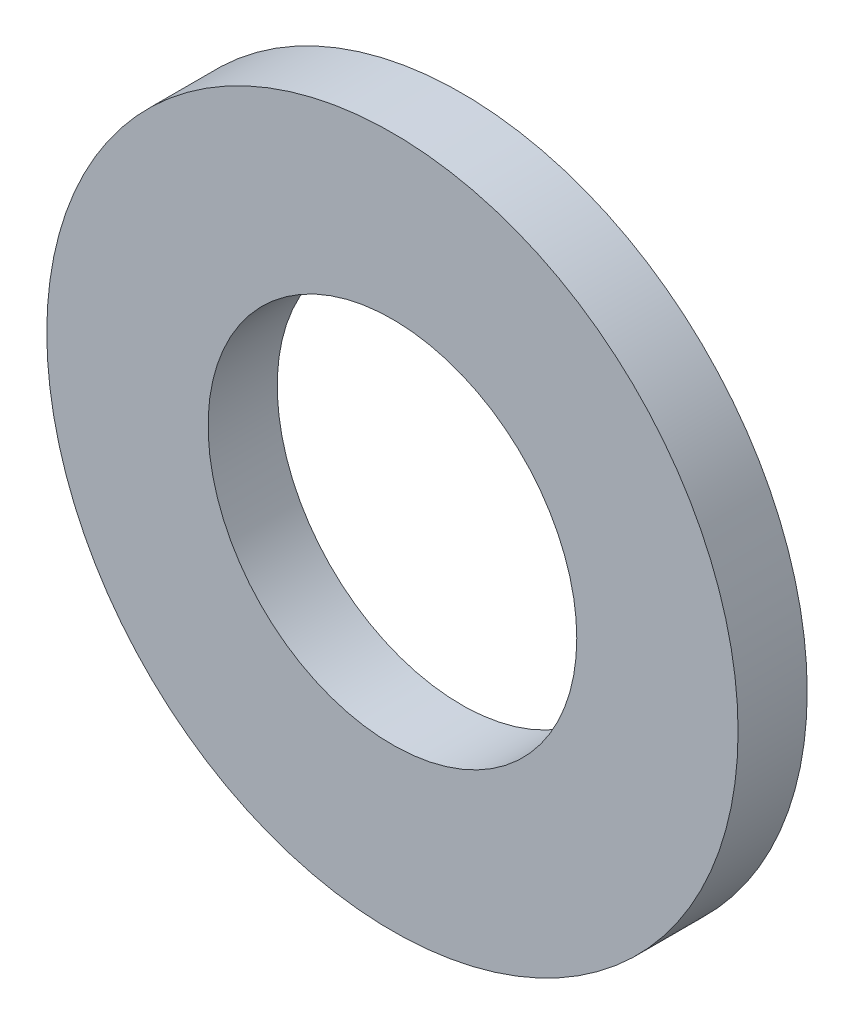
ISO-10303-21;
HEADER;
FILE_DESCRIPTION(('STEP AP214'),'2;1');
FILE_NAME('part.step','',(''),(''),'','','');
FILE_SCHEMA(('AUTOMOTIVE_DESIGN { 1 0 10303 214 1 1 1 1 }'));
ENDSEC;
DATA;
#1=APPLICATION_CONTEXT('core data for automotive mechanical design processes');
#2=APPLICATION_PROTOCOL_DEFINITION('international standard','automotive_design',2000,#1);
#3=PRODUCT_CONTEXT('',#1,'mechanical');
#4=PRODUCT('Part','Part','',(#3));
#5=PRODUCT_RELATED_PRODUCT_CATEGORY('part','',(#4));
#6=PRODUCT_DEFINITION_FORMATION('','',#4);
#7=PRODUCT_DEFINITION_CONTEXT('part definition',#1,'design');
#8=PRODUCT_DEFINITION('design','',#6,#7);
#9=PRODUCT_DEFINITION_SHAPE('','',#8);
#10=(LENGTH_UNIT() NAMED_UNIT(*) SI_UNIT(.MILLI.,.METRE.));
#11=(NAMED_UNIT(*) PLANE_ANGLE_UNIT() SI_UNIT($,.RADIAN.));
#12=(NAMED_UNIT(*) SI_UNIT($,.STERADIAN.) SOLID_ANGLE_UNIT());
#13=UNCERTAINTY_MEASURE_WITH_UNIT(LENGTH_MEASURE(1.E-05),#10,'distance_accuracy_value','');
#14=(GEOMETRIC_REPRESENTATION_CONTEXT(3) GLOBAL_UNCERTAINTY_ASSIGNED_CONTEXT((#13)) GLOBAL_UNIT_ASSIGNED_CONTEXT((#10,
#11,#12)) REPRESENTATION_CONTEXT('',''));
#15=CARTESIAN_POINT('',(0.,0.,0.));
#16=DIRECTION('',(0.,0.,1.));
#17=DIRECTION('',(1.,0.,0.));
#18=AXIS2_PLACEMENT_3D('',#15,#16,#17);
#19=CARTESIAN_POINT('',(0.,0.,0.6));
#20=DIRECTION('',(0.,0.,1.));
#21=DIRECTION('',(1.,0.,0.));
#22=AXIS2_PLACEMENT_3D('',#19,#20,#21);
#23=PLANE('',#22);
#24=CARTESIAN_POINT('',(0.,0.,0.6));
#25=DIRECTION('',(0.,0.,1.));
#26=DIRECTION('',(1.,0.,0.));
#27=AXIS2_PLACEMENT_3D('',#24,#25,#26);
#28=CIRCLE('',#27,3.);
#29=CARTESIAN_POINT('',(3.,0.,0.6));
#30=VERTEX_POINT('',#29);
#31=EDGE_CURVE('E10',#30,#30,#28,.T.);
#32=ORIENTED_EDGE('',*,*,#31,.T.);
#33=EDGE_LOOP('',(#32));
#34=FACE_BOUND('',#33,.T.);
#35=CARTESIAN_POINT('',(0.,0.,0.6));
#36=DIRECTION('',(0.,0.,1.));
#37=DIRECTION('',(1.,0.,0.));
#38=AXIS2_PLACEMENT_3D('',#35,#36,#37);
#39=CIRCLE('',#38,1.6);
#40=CARTESIAN_POINT('',(1.6,0.,0.6));
#41=VERTEX_POINT('',#40);
#42=EDGE_CURVE('E42',#41,#41,#39,.T.);
#43=ORIENTED_EDGE('',*,*,#42,.F.);
#44=EDGE_LOOP('',(#43));
#45=FACE_BOUND('',#44,.T.);
#46=ADVANCED_FACE('F31',(#34,#45),#23,.T.);
#47=CARTESIAN_POINT('',(0.,0.,0.));
#48=DIRECTION('',(0.,0.,1.));
#49=DIRECTION('',(1.,0.,0.));
#50=AXIS2_PLACEMENT_3D('',#47,#48,#49);
#51=PLANE('',#50);
#52=CARTESIAN_POINT('',(0.,0.,0.));
#53=DIRECTION('',(0.,0.,1.));
#54=DIRECTION('',(1.,0.,0.));
#55=AXIS2_PLACEMENT_3D('',#52,#53,#54);
#56=CIRCLE('',#55,3.);
#57=CARTESIAN_POINT('',(3.,0.,0.));
#58=VERTEX_POINT('',#57);
#59=EDGE_CURVE('E35',#58,#58,#56,.T.);
#60=ORIENTED_EDGE('',*,*,#59,.F.);
#61=EDGE_LOOP('',(#60));
#62=FACE_BOUND('',#61,.T.);
#63=CARTESIAN_POINT('',(0.,0.,0.));
#64=DIRECTION('',(0.,0.,1.));
#65=DIRECTION('',(1.,0.,0.));
#66=AXIS2_PLACEMENT_3D('',#63,#64,#65);
#67=CIRCLE('',#66,1.6);
#68=CARTESIAN_POINT('',(1.6,0.,0.));
#69=VERTEX_POINT('',#68);
#70=EDGE_CURVE('E44',#69,#69,#67,.T.);
#71=ORIENTED_EDGE('',*,*,#70,.T.);
#72=EDGE_LOOP('',(#71));
#73=FACE_BOUND('',#72,.T.);
#74=ADVANCED_FACE('F54',(#62,#73),#51,.F.);
#75=CARTESIAN_POINT('',(0.,0.,0.6));
#76=DIRECTION('',(0.,0.,-1.));
#77=DIRECTION('',(-1.,0.,0.));
#78=AXIS2_PLACEMENT_3D('',#75,#76,#77);
#79=CYLINDRICAL_SURFACE('',#78,3.);
#80=ORIENTED_EDGE('',*,*,#31,.F.);
#81=EDGE_LOOP('',(#80));
#82=FACE_BOUND('',#81,.T.);
#83=ORIENTED_EDGE('',*,*,#59,.T.);
#84=EDGE_LOOP('',(#83));
#85=FACE_BOUND('',#84,.T.);
#86=ADVANCED_FACE('F33',(#82,#85),#79,.T.);
#87=CARTESIAN_POINT('',(0.,0.,0.6));
#88=DIRECTION('',(0.,0.,-1.));
#89=DIRECTION('',(-1.,0.,0.));
#90=AXIS2_PLACEMENT_3D('',#87,#88,#89);
#91=CYLINDRICAL_SURFACE('',#90,1.6);
#92=ORIENTED_EDGE('',*,*,#42,.T.);
#93=EDGE_LOOP('',(#92));
#94=FACE_BOUND('',#93,.T.);
#95=ORIENTED_EDGE('',*,*,#70,.F.);
#96=EDGE_LOOP('',(#95));
#97=FACE_BOUND('',#96,.T.);
#98=ADVANCED_FACE('F50',(#94,#97),#91,.F.);
#99=CLOSED_SHELL('',(#46,#74,#86,#98));
#100=MANIFOLD_SOLID_BREP('B2',#99);
#101=ADVANCED_BREP_SHAPE_REPRESENTATION('',(#18,#100),#14);
#102=SHAPE_DEFINITION_REPRESENTATION(#9,#101);
ENDSEC;
END-ISO-10303-21;
